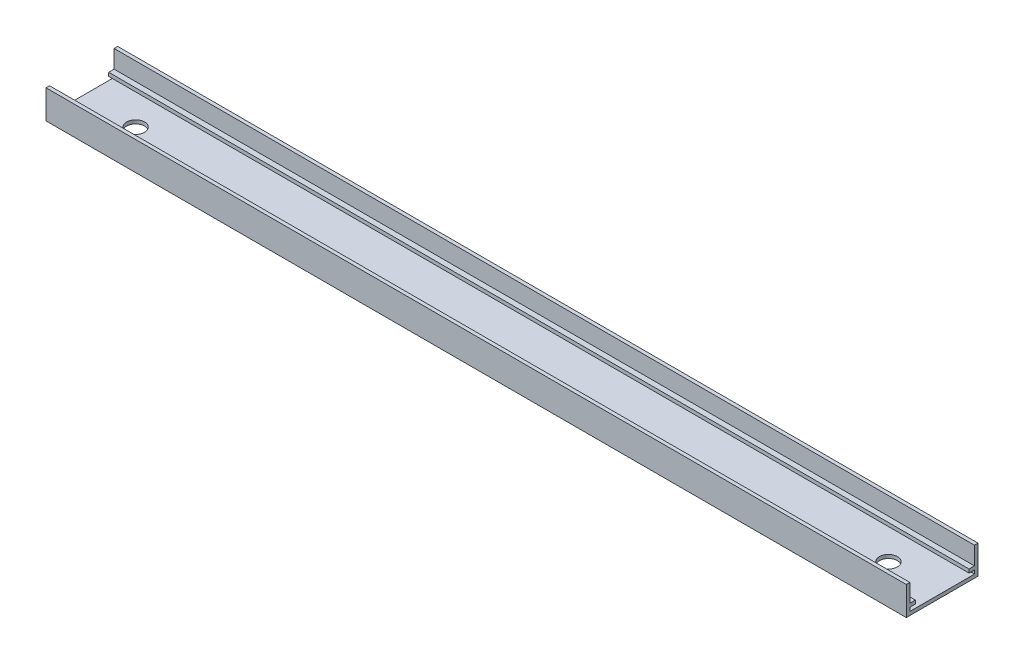
ISO-10303-21;
HEADER;
FILE_DESCRIPTION(('STEP AP214'),'2;1');
FILE_NAME('part.step','',(''),(''),'','','');
FILE_SCHEMA(('AUTOMOTIVE_DESIGN { 1 0 10303 214 1 1 1 1 }'));
ENDSEC;
DATA;
#1=APPLICATION_CONTEXT('core data for automotive mechanical design processes');
#2=APPLICATION_PROTOCOL_DEFINITION('international standard','automotive_design',2000,#1);
#3=PRODUCT_CONTEXT('',#1,'mechanical');
#4=PRODUCT('Part','Part','',(#3));
#5=PRODUCT_RELATED_PRODUCT_CATEGORY('part','',(#4));
#6=PRODUCT_DEFINITION_FORMATION('','',#4);
#7=PRODUCT_DEFINITION_CONTEXT('part definition',#1,'design');
#8=PRODUCT_DEFINITION('design','',#6,#7);
#9=PRODUCT_DEFINITION_SHAPE('','',#8);
#10=(LENGTH_UNIT() NAMED_UNIT(*) SI_UNIT(.MILLI.,.METRE.));
#11=(NAMED_UNIT(*) PLANE_ANGLE_UNIT() SI_UNIT($,.RADIAN.));
#12=(NAMED_UNIT(*) SI_UNIT($,.STERADIAN.) SOLID_ANGLE_UNIT());
#13=UNCERTAINTY_MEASURE_WITH_UNIT(LENGTH_MEASURE(1.E-05),#10,'distance_accuracy_value','');
#14=(GEOMETRIC_REPRESENTATION_CONTEXT(3) GLOBAL_UNCERTAINTY_ASSIGNED_CONTEXT((#13)) GLOBAL_UNIT_ASSIGNED_CONTEXT((#10,
#11,#12)) REPRESENTATION_CONTEXT('',''));
#15=CARTESIAN_POINT('',(0.,0.,0.));
#16=DIRECTION('',(0.,0.,1.));
#17=DIRECTION('',(1.,0.,0.));
#18=AXIS2_PLACEMENT_3D('',#15,#16,#17);
#19=CARTESIAN_POINT('',(-304.8,0.,0.));
#20=DIRECTION('',(0.,0.,1.));
#21=DIRECTION('',(1.,0.,0.));
#22=AXIS2_PLACEMENT_3D('',#19,#20,#21);
#23=PLANE('',#22);
#24=DIRECTION('',(0.,-1.,0.));
#25=VECTOR('',#24,1.);
#26=CARTESIAN_POINT('',(0.,0.,0.));
#27=LINE('',#26,#25);
#28=CARTESIAN_POINT('',(0.,10.16,0.));
#29=VERTEX_POINT('',#28);
#30=CARTESIAN_POINT('',(0.,0.,0.));
#31=VERTEX_POINT('',#30);
#32=EDGE_CURVE('E189',#29,#31,#27,.T.);
#33=ORIENTED_EDGE('',*,*,#32,.F.);
#34=DIRECTION('',(1.,0.,0.));
#35=VECTOR('',#34,1.);
#36=CARTESIAN_POINT('',(-304.8,10.16,0.));
#37=LINE('',#36,#35);
#38=CARTESIAN_POINT('',(-304.8,10.16,0.));
#39=VERTEX_POINT('',#38);
#40=EDGE_CURVE('E11',#39,#29,#37,.T.);
#41=ORIENTED_EDGE('',*,*,#40,.F.);
#42=DIRECTION('',(0.,-1.,0.));
#43=VECTOR('',#42,1.);
#44=CARTESIAN_POINT('',(-304.8,0.,0.));
#45=LINE('',#44,#43);
#46=CARTESIAN_POINT('',(-304.8,0.,0.));
#47=VERTEX_POINT('',#46);
#48=EDGE_CURVE('E233',#39,#47,#45,.T.);
#49=ORIENTED_EDGE('',*,*,#48,.T.);
#50=DIRECTION('',(1.,0.,0.));
#51=VECTOR('',#50,1.);
#52=CARTESIAN_POINT('',(-304.8,0.,0.));
#53=LINE('',#52,#51);
#54=EDGE_CURVE('E46',#47,#31,#53,.T.);
#55=ORIENTED_EDGE('',*,*,#54,.T.);
#56=EDGE_LOOP('',(#33,#41,#49,#55));
#57=FACE_BOUND('',#56,.T.);
#58=ADVANCED_FACE('F43',(#57),#23,.T.);
#59=CARTESIAN_POINT('',(-304.8,10.16,0.));
#60=DIRECTION('',(0.,1.,0.));
#61=DIRECTION('',(0.,0.,1.));
#62=AXIS2_PLACEMENT_3D('',#59,#60,#61);
#63=PLANE('',#62);
#64=DIRECTION('',(0.,0.,1.));
#65=VECTOR('',#64,1.);
#66=CARTESIAN_POINT('',(0.,10.16,0.));
#67=LINE('',#66,#65);
#68=CARTESIAN_POINT('',(0.,10.16,-1.27));
#69=VERTEX_POINT('',#68);
#70=EDGE_CURVE('E232',#69,#29,#67,.T.);
#71=ORIENTED_EDGE('',*,*,#70,.F.);
#72=DIRECTION('',(1.,0.,0.));
#73=VECTOR('',#72,1.);
#74=CARTESIAN_POINT('',(-304.8,10.16,-1.27));
#75=LINE('',#74,#73);
#76=CARTESIAN_POINT('',(-304.8,10.16,-1.27));
#77=VERTEX_POINT('',#76);
#78=EDGE_CURVE('E55',#77,#69,#75,.T.);
#79=ORIENTED_EDGE('',*,*,#78,.F.);
#80=DIRECTION('',(0.,0.,1.));
#81=VECTOR('',#80,1.);
#82=CARTESIAN_POINT('',(-304.8,10.16,0.));
#83=LINE('',#82,#81);
#84=EDGE_CURVE('E178',#77,#39,#83,.T.);
#85=ORIENTED_EDGE('',*,*,#84,.T.);
#86=ORIENTED_EDGE('',*,*,#40,.T.);
#87=EDGE_LOOP('',(#71,#79,#85,#86));
#88=FACE_BOUND('',#87,.T.);
#89=ADVANCED_FACE('F261',(#88),#63,.T.);
#90=CARTESIAN_POINT('',(-304.8,10.16,-1.27));
#91=DIRECTION('',(0.,0.,-1.));
#92=DIRECTION('',(0.,1.,0.));
#93=AXIS2_PLACEMENT_3D('',#90,#91,#92);
#94=PLANE('',#93);
#95=DIRECTION('',(0.,1.,0.));
#96=VECTOR('',#95,1.);
#97=CARTESIAN_POINT('',(0.,10.16,-1.27));
#98=LINE('',#97,#96);
#99=CARTESIAN_POINT('',(0.,3.81,-1.27));
#100=VERTEX_POINT('',#99);
#101=EDGE_CURVE('E164',#100,#69,#98,.T.);
#102=ORIENTED_EDGE('',*,*,#101,.F.);
#103=DIRECTION('',(1.,0.,0.));
#104=VECTOR('',#103,1.);
#105=CARTESIAN_POINT('',(-304.8,3.81,-1.27));
#106=LINE('',#105,#104);
#107=CARTESIAN_POINT('',(-304.8,3.81,-1.27));
#108=VERTEX_POINT('',#107);
#109=EDGE_CURVE('E159',#108,#100,#106,.T.);
#110=ORIENTED_EDGE('',*,*,#109,.F.);
#111=DIRECTION('',(0.,1.,0.));
#112=VECTOR('',#111,1.);
#113=CARTESIAN_POINT('',(-304.8,10.16,-1.27));
#114=LINE('',#113,#112);
#115=EDGE_CURVE('E162',#108,#77,#114,.T.);
#116=ORIENTED_EDGE('',*,*,#115,.T.);
#117=ORIENTED_EDGE('',*,*,#78,.T.);
#118=EDGE_LOOP('',(#102,#110,#116,#117));
#119=FACE_BOUND('',#118,.T.);
#120=ADVANCED_FACE('F165',(#119),#94,.T.);
#121=CARTESIAN_POINT('',(-304.8,3.81,-1.27));
#122=DIRECTION('',(0.,1.,0.));
#123=DIRECTION('',(0.,0.,1.));
#124=AXIS2_PLACEMENT_3D('',#121,#122,#123);
#125=PLANE('',#124);
#126=DIRECTION('',(0.,0.,1.));
#127=VECTOR('',#126,1.);
#128=CARTESIAN_POINT('',(0.,3.81,-1.27));
#129=LINE('',#128,#127);
#130=CARTESIAN_POINT('',(0.,3.81,-3.17589116415839));
#131=VERTEX_POINT('',#130);
#132=EDGE_CURVE('E229',#131,#100,#129,.T.);
#133=ORIENTED_EDGE('',*,*,#132,.F.);
#134=DIRECTION('',(1.,0.,0.));
#135=VECTOR('',#134,1.);
#136=CARTESIAN_POINT('',(-304.8,3.81,-3.17589116415839));
#137=LINE('',#136,#135);
#138=CARTESIAN_POINT('',(-304.8,3.81,-3.17589116415839));
#139=VERTEX_POINT('',#138);
#140=EDGE_CURVE('E168',#139,#131,#137,.T.);
#141=ORIENTED_EDGE('',*,*,#140,.F.);
#142=DIRECTION('',(0.,0.,1.));
#143=VECTOR('',#142,1.);
#144=CARTESIAN_POINT('',(-304.8,3.81,-1.27));
#145=LINE('',#144,#143);
#146=EDGE_CURVE('E177',#139,#108,#145,.T.);
#147=ORIENTED_EDGE('',*,*,#146,.T.);
#148=ORIENTED_EDGE('',*,*,#109,.T.);
#149=EDGE_LOOP('',(#133,#141,#147,#148));
#150=FACE_BOUND('',#149,.T.);
#151=ADVANCED_FACE('F176',(#150),#125,.T.);
#152=CARTESIAN_POINT('',(-304.8,3.81,-3.17589116415839));
#153=DIRECTION('',(0.,0.,-1.));
#154=DIRECTION('',(-1.,0.,0.));
#155=AXIS2_PLACEMENT_3D('',#152,#153,#154);
#156=PLANE('',#155);
#157=DIRECTION('',(0.,1.,0.));
#158=VECTOR('',#157,1.);
#159=CARTESIAN_POINT('',(0.,3.81,-3.17589116415839));
#160=LINE('',#159,#158);
#161=CARTESIAN_POINT('',(0.,2.54,-3.17589116415839));
#162=VERTEX_POINT('',#161);
#163=EDGE_CURVE('E223',#162,#131,#160,.T.);
#164=ORIENTED_EDGE('',*,*,#163,.F.);
#165=DIRECTION('',(1.,0.,0.));
#166=VECTOR('',#165,1.);
#167=CARTESIAN_POINT('',(-304.8,2.54,-3.17589116415839));
#168=LINE('',#167,#166);
#169=CARTESIAN_POINT('',(-304.8,2.54,-3.17589116415839));
#170=VERTEX_POINT('',#169);
#171=EDGE_CURVE('E240',#170,#162,#168,.T.);
#172=ORIENTED_EDGE('',*,*,#171,.F.);
#173=DIRECTION('',(0.,1.,0.));
#174=VECTOR('',#173,1.);
#175=CARTESIAN_POINT('',(-304.8,3.81,-3.17589116415839));
#176=LINE('',#175,#174);
#177=EDGE_CURVE('E182',#170,#139,#176,.T.);
#178=ORIENTED_EDGE('',*,*,#177,.T.);
#179=ORIENTED_EDGE('',*,*,#140,.T.);
#180=EDGE_LOOP('',(#164,#172,#178,#179));
#181=FACE_BOUND('',#180,.T.);
#182=ADVANCED_FACE('F273',(#181),#156,.T.);
#183=CARTESIAN_POINT('',(-304.8,2.54,-3.17589116415839));
#184=DIRECTION('',(0.,-1.,0.));
#185=DIRECTION('',(0.,0.,-1.));
#186=AXIS2_PLACEMENT_3D('',#183,#184,#185);
#187=PLANE('',#186);
#188=DIRECTION('',(0.,0.,-1.));
#189=VECTOR('',#188,1.);
#190=CARTESIAN_POINT('',(0.,2.54,-3.17589116415839));
#191=LINE('',#190,#189);
#192=CARTESIAN_POINT('',(0.,2.54,-1.27));
#193=VERTEX_POINT('',#192);
#194=EDGE_CURVE('E225',#193,#162,#191,.T.);
#195=ORIENTED_EDGE('',*,*,#194,.F.);
#196=DIRECTION('',(1.,0.,0.));
#197=VECTOR('',#196,1.);
#198=CARTESIAN_POINT('',(-304.8,2.54,-1.27));
#199=LINE('',#198,#197);
#200=CARTESIAN_POINT('',(-304.8,2.54,-1.27));
#201=VERTEX_POINT('',#200);
#202=EDGE_CURVE('E239',#201,#193,#199,.T.);
#203=ORIENTED_EDGE('',*,*,#202,.F.);
#204=DIRECTION('',(0.,0.,-1.));
#205=VECTOR('',#204,1.);
#206=CARTESIAN_POINT('',(-304.8,2.54,-3.17589116415839));
#207=LINE('',#206,#205);
#208=EDGE_CURVE('E181',#201,#170,#207,.T.);
#209=ORIENTED_EDGE('',*,*,#208,.T.);
#210=ORIENTED_EDGE('',*,*,#171,.T.);
#211=EDGE_LOOP('',(#195,#203,#209,#210));
#212=FACE_BOUND('',#211,.T.);
#213=ADVANCED_FACE('F280',(#212),#187,.T.);
#214=CARTESIAN_POINT('',(-304.8,2.54,-1.27));
#215=DIRECTION('',(0.,0.,-1.));
#216=DIRECTION('',(0.,1.,0.));
#217=AXIS2_PLACEMENT_3D('',#214,#215,#216);
#218=PLANE('',#217);
#219=DIRECTION('',(0.,1.,0.));
#220=VECTOR('',#219,1.);
#221=CARTESIAN_POINT('',(0.,2.54,-1.27));
#222=LINE('',#221,#220);
#223=CARTESIAN_POINT('',(0.,1.27,-1.27));
#224=VERTEX_POINT('',#223);
#225=EDGE_CURVE('E218',#224,#193,#222,.T.);
#226=ORIENTED_EDGE('',*,*,#225,.F.);
#227=DIRECTION('',(1.,0.,0.));
#228=VECTOR('',#227,1.);
#229=CARTESIAN_POINT('',(-304.8,1.27,-1.27));
#230=LINE('',#229,#228);
#231=CARTESIAN_POINT('',(-304.8,1.27,-1.27));
#232=VERTEX_POINT('',#231);
#233=EDGE_CURVE('E242',#232,#224,#230,.T.);
#234=ORIENTED_EDGE('',*,*,#233,.F.);
#235=DIRECTION('',(0.,1.,0.));
#236=VECTOR('',#235,1.);
#237=CARTESIAN_POINT('',(-304.8,2.54,-1.27));
#238=LINE('',#237,#236);
#239=EDGE_CURVE('E365',#232,#201,#238,.T.);
#240=ORIENTED_EDGE('',*,*,#239,.T.);
#241=ORIENTED_EDGE('',*,*,#202,.T.);
#242=EDGE_LOOP('',(#226,#234,#240,#241));
#243=FACE_BOUND('',#242,.T.);
#244=ADVANCED_FACE('F282',(#243),#218,.T.);
#245=CARTESIAN_POINT('',(-304.8,1.27,-1.27));
#246=DIRECTION('',(0.,1.,0.));
#247=DIRECTION('',(0.,0.,1.));
#248=AXIS2_PLACEMENT_3D('',#245,#246,#247);
#249=PLANE('',#248);
#250=CARTESIAN_POINT('',(-285.75,1.27,-12.7));
#251=DIRECTION('',(0.,1.,0.));
#252=DIRECTION('',(0.,0.,1.));
#253=AXIS2_PLACEMENT_3D('',#250,#251,#252);
#254=CIRCLE('',#253,3.17499999999997);
#255=CARTESIAN_POINT('',(-285.75,1.27,-9.52500000000003));
#256=VERTEX_POINT('',#255);
#257=EDGE_CURVE('E334',#256,#256,#254,.T.);
#258=ORIENTED_EDGE('',*,*,#257,.F.);
#259=EDGE_LOOP('',(#258));
#260=FACE_BOUND('',#259,.T.);
#261=CARTESIAN_POINT('',(-19.05,1.27,-12.7));
#262=DIRECTION('',(0.,1.,0.));
#263=DIRECTION('',(0.,0.,-1.));
#264=AXIS2_PLACEMENT_3D('',#261,#262,#263);
#265=CIRCLE('',#264,3.17499999999997);
#266=CARTESIAN_POINT('',(-19.05,1.27,-15.875));
#267=VERTEX_POINT('',#266);
#268=EDGE_CURVE('E329',#267,#267,#265,.T.);
#269=ORIENTED_EDGE('',*,*,#268,.F.);
#270=EDGE_LOOP('',(#269));
#271=FACE_BOUND('',#270,.T.);
#272=DIRECTION('',(0.,0.,1.));
#273=VECTOR('',#272,1.);
#274=CARTESIAN_POINT('',(0.,1.27,-1.27));
#275=LINE('',#274,#273);
#276=CARTESIAN_POINT('',(0.,1.27,-24.13));
#277=VERTEX_POINT('',#276);
#278=EDGE_CURVE('E216',#277,#224,#275,.T.);
#279=ORIENTED_EDGE('',*,*,#278,.F.);
#280=DIRECTION('',(1.,0.,0.));
#281=VECTOR('',#280,1.);
#282=CARTESIAN_POINT('',(-304.8,1.27,-24.13));
#283=LINE('',#282,#281);
#284=CARTESIAN_POINT('',(-304.8,1.27,-24.13));
#285=VERTEX_POINT('',#284);
#286=EDGE_CURVE('E244',#285,#277,#283,.T.);
#287=ORIENTED_EDGE('',*,*,#286,.F.);
#288=DIRECTION('',(0.,0.,1.));
#289=VECTOR('',#288,1.);
#290=CARTESIAN_POINT('',(-304.8,1.27,-1.27));
#291=LINE('',#290,#289);
#292=EDGE_CURVE('E363',#285,#232,#291,.T.);
#293=ORIENTED_EDGE('',*,*,#292,.T.);
#294=ORIENTED_EDGE('',*,*,#233,.T.);
#295=EDGE_LOOP('',(#279,#287,#293,#294));
#296=FACE_BOUND('',#295,.T.);
#297=ADVANCED_FACE('F283',(#260,#271,#296),#249,.T.);
#298=CARTESIAN_POINT('',(-304.8,2.54,-24.13));
#299=DIRECTION('',(0.,0.,1.));
#300=DIRECTION('',(1.,0.,0.));
#301=AXIS2_PLACEMENT_3D('',#298,#299,#300);
#302=PLANE('',#301);
#303=DIRECTION('',(0.,-1.,0.));
#304=VECTOR('',#303,1.);
#305=CARTESIAN_POINT('',(0.,2.54,-24.13));
#306=LINE('',#305,#304);
#307=CARTESIAN_POINT('',(0.,2.54,-24.13));
#308=VERTEX_POINT('',#307);
#309=EDGE_CURVE('E213',#308,#277,#306,.T.);
#310=ORIENTED_EDGE('',*,*,#309,.F.);
#311=DIRECTION('',(1.,0.,0.));
#312=VECTOR('',#311,1.);
#313=CARTESIAN_POINT('',(-304.8,2.54,-24.13));
#314=LINE('',#313,#312);
#315=CARTESIAN_POINT('',(-304.8,2.54,-24.13));
#316=VERTEX_POINT('',#315);
#317=EDGE_CURVE('E243',#316,#308,#314,.T.);
#318=ORIENTED_EDGE('',*,*,#317,.F.);
#319=DIRECTION('',(0.,-1.,0.));
#320=VECTOR('',#319,1.);
#321=CARTESIAN_POINT('',(-304.8,2.54,-24.13));
#322=LINE('',#321,#320);
#323=EDGE_CURVE('E358',#316,#285,#322,.T.);
#324=ORIENTED_EDGE('',*,*,#323,.T.);
#325=ORIENTED_EDGE('',*,*,#286,.T.);
#326=EDGE_LOOP('',(#310,#318,#324,#325));
#327=FACE_BOUND('',#326,.T.);
#328=ADVANCED_FACE('F289',(#327),#302,.T.);
#329=CARTESIAN_POINT('',(-304.8,2.54,-22.2241088358416));
#330=DIRECTION('',(0.,-1.,0.));
#331=DIRECTION('',(0.,0.,-1.));
#332=AXIS2_PLACEMENT_3D('',#329,#330,#331);
#333=PLANE('',#332);
#334=DIRECTION('',(0.,0.,-1.));
#335=VECTOR('',#334,1.);
#336=CARTESIAN_POINT('',(0.,2.54,-22.2241088358416));
#337=LINE('',#336,#335);
#338=CARTESIAN_POINT('',(0.,2.54,-22.2241088358416));
#339=VERTEX_POINT('',#338);
#340=EDGE_CURVE('E209',#339,#308,#337,.T.);
#341=ORIENTED_EDGE('',*,*,#340,.F.);
#342=DIRECTION('',(1.,0.,0.));
#343=VECTOR('',#342,1.);
#344=CARTESIAN_POINT('',(-304.8,2.54,-22.2241088358416));
#345=LINE('',#344,#343);
#346=CARTESIAN_POINT('',(-304.8,2.54,-22.2241088358416));
#347=VERTEX_POINT('',#346);
#348=EDGE_CURVE('E250',#347,#339,#345,.T.);
#349=ORIENTED_EDGE('',*,*,#348,.F.);
#350=DIRECTION('',(0.,0.,-1.));
#351=VECTOR('',#350,1.);
#352=CARTESIAN_POINT('',(-304.8,2.54,-22.2241088358416));
#353=LINE('',#352,#351);
#354=EDGE_CURVE('E353',#347,#316,#353,.T.);
#355=ORIENTED_EDGE('',*,*,#354,.T.);
#356=ORIENTED_EDGE('',*,*,#317,.T.);
#357=EDGE_LOOP('',(#341,#349,#355,#356));
#358=FACE_BOUND('',#357,.T.);
#359=ADVANCED_FACE('F291',(#358),#333,.T.);
#360=CARTESIAN_POINT('',(-304.8,3.81,-22.2241088358416));
#361=DIRECTION('',(0.,0.,1.));
#362=DIRECTION('',(1.,0.,0.));
#363=AXIS2_PLACEMENT_3D('',#360,#361,#362);
#364=PLANE('',#363);
#365=DIRECTION('',(0.,-1.,0.));
#366=VECTOR('',#365,1.);
#367=CARTESIAN_POINT('',(0.,3.81,-22.2241088358416));
#368=LINE('',#367,#366);
#369=CARTESIAN_POINT('',(0.,3.81,-22.2241088358416));
#370=VERTEX_POINT('',#369);
#371=EDGE_CURVE('E210',#370,#339,#368,.T.);
#372=ORIENTED_EDGE('',*,*,#371,.F.);
#373=DIRECTION('',(1.,0.,0.));
#374=VECTOR('',#373,1.);
#375=CARTESIAN_POINT('',(-304.8,3.81,-22.2241088358416));
#376=LINE('',#375,#374);
#377=CARTESIAN_POINT('',(-304.8,3.81,-22.2241088358416));
#378=VERTEX_POINT('',#377);
#379=EDGE_CURVE('E249',#378,#370,#376,.T.);
#380=ORIENTED_EDGE('',*,*,#379,.F.);
#381=DIRECTION('',(0.,-1.,0.));
#382=VECTOR('',#381,1.);
#383=CARTESIAN_POINT('',(-304.8,3.81,-22.2241088358416));
#384=LINE('',#383,#382);
#385=EDGE_CURVE('E355',#378,#347,#384,.T.);
#386=ORIENTED_EDGE('',*,*,#385,.T.);
#387=ORIENTED_EDGE('',*,*,#348,.T.);
#388=EDGE_LOOP('',(#372,#380,#386,#387));
#389=FACE_BOUND('',#388,.T.);
#390=ADVANCED_FACE('F300',(#389),#364,.T.);
#391=CARTESIAN_POINT('',(-304.8,3.81,-24.13));
#392=DIRECTION('',(0.,1.,0.));
#393=DIRECTION('',(0.,0.,1.));
#394=AXIS2_PLACEMENT_3D('',#391,#392,#393);
#395=PLANE('',#394);
#396=DIRECTION('',(0.,0.,1.));
#397=VECTOR('',#396,1.);
#398=CARTESIAN_POINT('',(0.,3.81,-24.13));
#399=LINE('',#398,#397);
#400=CARTESIAN_POINT('',(0.,3.81,-24.13));
#401=VERTEX_POINT('',#400);
#402=EDGE_CURVE('E204',#401,#370,#399,.T.);
#403=ORIENTED_EDGE('',*,*,#402,.F.);
#404=DIRECTION('',(1.,0.,0.));
#405=VECTOR('',#404,1.);
#406=CARTESIAN_POINT('',(-304.8,3.81,-24.13));
#407=LINE('',#406,#405);
#408=CARTESIAN_POINT('',(-304.8,3.81,-24.13));
#409=VERTEX_POINT('',#408);
#410=EDGE_CURVE('E253',#409,#401,#407,.T.);
#411=ORIENTED_EDGE('',*,*,#410,.F.);
#412=DIRECTION('',(0.,0.,1.));
#413=VECTOR('',#412,1.);
#414=CARTESIAN_POINT('',(-304.8,3.81,-24.13));
#415=LINE('',#414,#413);
#416=EDGE_CURVE('E349',#409,#378,#415,.T.);
#417=ORIENTED_EDGE('',*,*,#416,.T.);
#418=ORIENTED_EDGE('',*,*,#379,.T.);
#419=EDGE_LOOP('',(#403,#411,#417,#418));
#420=FACE_BOUND('',#419,.T.);
#421=ADVANCED_FACE('F302',(#420),#395,.T.);
#422=CARTESIAN_POINT('',(-304.8,10.16,-24.13));
#423=DIRECTION('',(0.,0.,1.));
#424=DIRECTION('',(1.,0.,0.));
#425=AXIS2_PLACEMENT_3D('',#422,#423,#424);
#426=PLANE('',#425);
#427=DIRECTION('',(0.,-1.,0.));
#428=VECTOR('',#427,1.);
#429=CARTESIAN_POINT('',(0.,10.16,-24.13));
#430=LINE('',#429,#428);
#431=CARTESIAN_POINT('',(0.,10.16,-24.13));
#432=VERTEX_POINT('',#431);
#433=EDGE_CURVE('E203',#432,#401,#430,.T.);
#434=ORIENTED_EDGE('',*,*,#433,.F.);
#435=DIRECTION('',(1.,0.,0.));
#436=VECTOR('',#435,1.);
#437=CARTESIAN_POINT('',(-304.8,10.16,-24.13));
#438=LINE('',#437,#436);
#439=CARTESIAN_POINT('',(-304.8,10.16,-24.13));
#440=VERTEX_POINT('',#439);
#441=EDGE_CURVE('E251',#440,#432,#438,.T.);
#442=ORIENTED_EDGE('',*,*,#441,.F.);
#443=DIRECTION('',(0.,-1.,0.));
#444=VECTOR('',#443,1.);
#445=CARTESIAN_POINT('',(-304.8,10.16,-24.13));
#446=LINE('',#445,#444);
#447=EDGE_CURVE('E347',#440,#409,#446,.T.);
#448=ORIENTED_EDGE('',*,*,#447,.T.);
#449=ORIENTED_EDGE('',*,*,#410,.T.);
#450=EDGE_LOOP('',(#434,#442,#448,#449));
#451=FACE_BOUND('',#450,.T.);
#452=ADVANCED_FACE('F301',(#451),#426,.T.);
#453=CARTESIAN_POINT('',(-304.8,10.16,-25.4));
#454=DIRECTION('',(0.,1.,0.));
#455=DIRECTION('',(0.,0.,1.));
#456=AXIS2_PLACEMENT_3D('',#453,#454,#455);
#457=PLANE('',#456);
#458=DIRECTION('',(0.,0.,1.));
#459=VECTOR('',#458,1.);
#460=CARTESIAN_POINT('',(0.,10.16,-25.4));
#461=LINE('',#460,#459);
#462=CARTESIAN_POINT('',(0.,10.16,-25.4));
#463=VERTEX_POINT('',#462);
#464=EDGE_CURVE('E196',#463,#432,#461,.T.);
#465=ORIENTED_EDGE('',*,*,#464,.F.);
#466=DIRECTION('',(1.,0.,0.));
#467=VECTOR('',#466,1.);
#468=CARTESIAN_POINT('',(-304.8,10.16,-25.4));
#469=LINE('',#468,#467);
#470=CARTESIAN_POINT('',(-304.8,10.16,-25.4));
#471=VERTEX_POINT('',#470);
#472=EDGE_CURVE('E254',#471,#463,#469,.T.);
#473=ORIENTED_EDGE('',*,*,#472,.F.);
#474=DIRECTION('',(0.,0.,1.));
#475=VECTOR('',#474,1.);
#476=CARTESIAN_POINT('',(-304.8,10.16,-25.4));
#477=LINE('',#476,#475);
#478=EDGE_CURVE('E343',#471,#440,#477,.T.);
#479=ORIENTED_EDGE('',*,*,#478,.T.);
#480=ORIENTED_EDGE('',*,*,#441,.T.);
#481=EDGE_LOOP('',(#465,#473,#479,#480));
#482=FACE_BOUND('',#481,.T.);
#483=ADVANCED_FACE('F310',(#482),#457,.T.);
#484=CARTESIAN_POINT('',(-304.8,0.,-25.4));
#485=DIRECTION('',(0.,0.,-1.));
#486=DIRECTION('',(-1.,0.,0.));
#487=AXIS2_PLACEMENT_3D('',#484,#485,#486);
#488=PLANE('',#487);
#489=DIRECTION('',(0.,1.,0.));
#490=VECTOR('',#489,1.);
#491=CARTESIAN_POINT('',(0.,0.,-25.4));
#492=LINE('',#491,#490);
#493=CARTESIAN_POINT('',(0.,0.,-25.4));
#494=VERTEX_POINT('',#493);
#495=EDGE_CURVE('E191',#494,#463,#492,.T.);
#496=ORIENTED_EDGE('',*,*,#495,.F.);
#497=DIRECTION('',(1.,0.,0.));
#498=VECTOR('',#497,1.);
#499=CARTESIAN_POINT('',(-304.8,0.,-25.4));
#500=LINE('',#499,#498);
#501=CARTESIAN_POINT('',(-304.8,0.,-25.4));
#502=VERTEX_POINT('',#501);
#503=EDGE_CURVE('E258',#502,#494,#500,.T.);
#504=ORIENTED_EDGE('',*,*,#503,.F.);
#505=DIRECTION('',(0.,1.,0.));
#506=VECTOR('',#505,1.);
#507=CARTESIAN_POINT('',(-304.8,0.,-25.4));
#508=LINE('',#507,#506);
#509=EDGE_CURVE('E338',#502,#471,#508,.T.);
#510=ORIENTED_EDGE('',*,*,#509,.T.);
#511=ORIENTED_EDGE('',*,*,#472,.T.);
#512=EDGE_LOOP('',(#496,#504,#510,#511));
#513=FACE_BOUND('',#512,.T.);
#514=ADVANCED_FACE('F311',(#513),#488,.T.);
#515=CARTESIAN_POINT('',(-304.8,0.,0.));
#516=DIRECTION('',(0.,-1.,0.));
#517=DIRECTION('',(0.,0.,-1.));
#518=AXIS2_PLACEMENT_3D('',#515,#516,#517);
#519=PLANE('',#518);
#520=CARTESIAN_POINT('',(-285.75,0.,-12.7));
#521=DIRECTION('',(0.,1.,0.));
#522=DIRECTION('',(0.,0.,1.));
#523=AXIS2_PLACEMENT_3D('',#520,#521,#522);
#524=CIRCLE('',#523,3.17499999999997);
#525=CARTESIAN_POINT('',(-285.75,0.,-9.52500000000003));
#526=VERTEX_POINT('',#525);
#527=EDGE_CURVE('E195',#526,#526,#524,.T.);
#528=ORIENTED_EDGE('',*,*,#527,.T.);
#529=EDGE_LOOP('',(#528));
#530=FACE_BOUND('',#529,.T.);
#531=CARTESIAN_POINT('',(-19.05,0.,-12.7));
#532=DIRECTION('',(0.,1.,0.));
#533=DIRECTION('',(0.,0.,-1.));
#534=AXIS2_PLACEMENT_3D('',#531,#532,#533);
#535=CIRCLE('',#534,3.17499999999997);
#536=CARTESIAN_POINT('',(-19.05,0.,-15.875));
#537=VERTEX_POINT('',#536);
#538=EDGE_CURVE('E327',#537,#537,#535,.T.);
#539=ORIENTED_EDGE('',*,*,#538,.T.);
#540=EDGE_LOOP('',(#539));
#541=FACE_BOUND('',#540,.T.);
#542=DIRECTION('',(0.,0.,-1.));
#543=VECTOR('',#542,1.);
#544=CARTESIAN_POINT('',(0.,0.,0.));
#545=LINE('',#544,#543);
#546=EDGE_CURVE('E192',#31,#494,#545,.T.);
#547=ORIENTED_EDGE('',*,*,#546,.F.);
#548=ORIENTED_EDGE('',*,*,#54,.F.);
#549=DIRECTION('',(0.,0.,-1.));
#550=VECTOR('',#549,1.);
#551=CARTESIAN_POINT('',(-304.8,0.,0.));
#552=LINE('',#551,#550);
#553=EDGE_CURVE('E339',#47,#502,#552,.T.);
#554=ORIENTED_EDGE('',*,*,#553,.T.);
#555=ORIENTED_EDGE('',*,*,#503,.T.);
#556=EDGE_LOOP('',(#547,#548,#554,#555));
#557=FACE_BOUND('',#556,.T.);
#558=ADVANCED_FACE('F256',(#530,#541,#557),#519,.T.);
#559=CARTESIAN_POINT('',(-304.8,0.,0.));
#560=DIRECTION('',(-1.,0.,0.));
#561=DIRECTION('',(0.,0.,1.));
#562=AXIS2_PLACEMENT_3D('',#559,#560,#561);
#563=PLANE('',#562);
#564=ORIENTED_EDGE('',*,*,#48,.F.);
#565=ORIENTED_EDGE('',*,*,#84,.F.);
#566=ORIENTED_EDGE('',*,*,#115,.F.);
#567=ORIENTED_EDGE('',*,*,#146,.F.);
#568=ORIENTED_EDGE('',*,*,#177,.F.);
#569=ORIENTED_EDGE('',*,*,#208,.F.);
#570=ORIENTED_EDGE('',*,*,#239,.F.);
#571=ORIENTED_EDGE('',*,*,#292,.F.);
#572=ORIENTED_EDGE('',*,*,#323,.F.);
#573=ORIENTED_EDGE('',*,*,#354,.F.);
#574=ORIENTED_EDGE('',*,*,#385,.F.);
#575=ORIENTED_EDGE('',*,*,#416,.F.);
#576=ORIENTED_EDGE('',*,*,#447,.F.);
#577=ORIENTED_EDGE('',*,*,#478,.F.);
#578=ORIENTED_EDGE('',*,*,#509,.F.);
#579=ORIENTED_EDGE('',*,*,#553,.F.);
#580=EDGE_LOOP('',(#564,#565,#566,#567,#568,#569,#570,#571,#572,#573,#574,#575,#576,#577,#578,#579));
#581=FACE_BOUND('',#580,.T.);
#582=ADVANCED_FACE('F171',(#581),#563,.T.);
#583=CARTESIAN_POINT('',(0.,0.,0.));
#584=DIRECTION('',(-1.,0.,0.));
#585=DIRECTION('',(0.,0.,1.));
#586=AXIS2_PLACEMENT_3D('',#583,#584,#585);
#587=PLANE('',#586);
#588=ORIENTED_EDGE('',*,*,#32,.T.);
#589=ORIENTED_EDGE('',*,*,#546,.T.);
#590=ORIENTED_EDGE('',*,*,#495,.T.);
#591=ORIENTED_EDGE('',*,*,#464,.T.);
#592=ORIENTED_EDGE('',*,*,#433,.T.);
#593=ORIENTED_EDGE('',*,*,#402,.T.);
#594=ORIENTED_EDGE('',*,*,#371,.T.);
#595=ORIENTED_EDGE('',*,*,#340,.T.);
#596=ORIENTED_EDGE('',*,*,#309,.T.);
#597=ORIENTED_EDGE('',*,*,#278,.T.);
#598=ORIENTED_EDGE('',*,*,#225,.T.);
#599=ORIENTED_EDGE('',*,*,#194,.T.);
#600=ORIENTED_EDGE('',*,*,#163,.T.);
#601=ORIENTED_EDGE('',*,*,#132,.T.);
#602=ORIENTED_EDGE('',*,*,#101,.T.);
#603=ORIENTED_EDGE('',*,*,#70,.T.);
#604=EDGE_LOOP('',(#588,#589,#590,#591,#592,#593,#594,#595,#596,#597,#598,#599,#600,#601,#602,#603));
#605=FACE_BOUND('',#604,.T.);
#606=ADVANCED_FACE('F257',(#605),#587,.F.);
#607=CARTESIAN_POINT('',(-19.05,0.,-12.7));
#608=DIRECTION('',(0.,1.,0.));
#609=DIRECTION('',(0.,0.,1.));
#610=AXIS2_PLACEMENT_3D('',#607,#608,#609);
#611=CYLINDRICAL_SURFACE('',#610,3.17499999999997);
#612=ORIENTED_EDGE('',*,*,#538,.F.);
#613=EDGE_LOOP('',(#612));
#614=FACE_BOUND('',#613,.T.);
#615=ORIENTED_EDGE('',*,*,#268,.T.);
#616=EDGE_LOOP('',(#615));
#617=FACE_BOUND('',#616,.T.);
#618=ADVANCED_FACE('F397',(#614,#617),#611,.F.);
#619=CARTESIAN_POINT('',(-285.75,0.,-12.7));
#620=DIRECTION('',(0.,1.,0.));
#621=DIRECTION('',(0.,0.,1.));
#622=AXIS2_PLACEMENT_3D('',#619,#620,#621);
#623=CYLINDRICAL_SURFACE('',#622,3.17499999999997);
#624=ORIENTED_EDGE('',*,*,#527,.F.);
#625=EDGE_LOOP('',(#624));
#626=FACE_BOUND('',#625,.T.);
#627=ORIENTED_EDGE('',*,*,#257,.T.);
#628=EDGE_LOOP('',(#627));
#629=FACE_BOUND('',#628,.T.);
#630=ADVANCED_FACE('F395',(#626,#629),#623,.F.);
#631=CLOSED_SHELL('',(#58,#89,#120,#151,#182,#213,#244,#297,#328,#359,#390,#421,#452,#483,#514,
#558,#582,#606,#618,#630));
#632=MANIFOLD_SOLID_BREP('B2',#631);
#633=ADVANCED_BREP_SHAPE_REPRESENTATION('',(#18,#632),#14);
#634=SHAPE_DEFINITION_REPRESENTATION(#9,#633);
ENDSEC;
END-ISO-10303-21;
